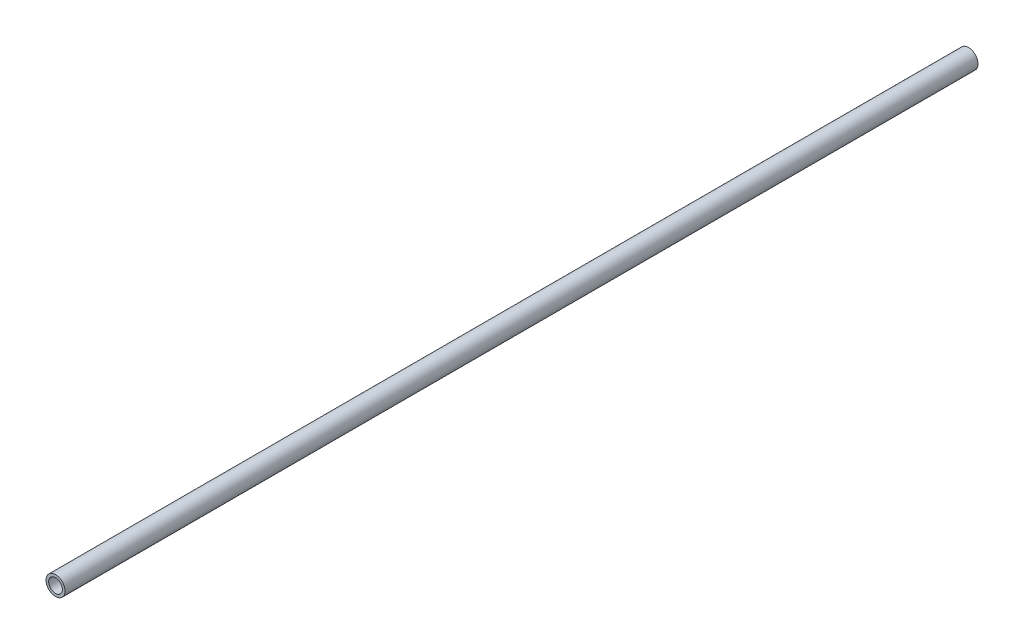
ISO-10303-21;
HEADER;
FILE_DESCRIPTION(('STEP AP214'),'2;1');
FILE_NAME('part.step','',(''),(''),'','','');
FILE_SCHEMA(('AUTOMOTIVE_DESIGN { 1 0 10303 214 1 1 1 1 }'));
ENDSEC;
DATA;
#1=APPLICATION_CONTEXT('core data for automotive mechanical design processes');
#2=APPLICATION_PROTOCOL_DEFINITION('international standard','automotive_design',2000,#1);
#3=PRODUCT_CONTEXT('',#1,'mechanical');
#4=PRODUCT('Part','Part','',(#3));
#5=PRODUCT_RELATED_PRODUCT_CATEGORY('part','',(#4));
#6=PRODUCT_DEFINITION_FORMATION('','',#4);
#7=PRODUCT_DEFINITION_CONTEXT('part definition',#1,'design');
#8=PRODUCT_DEFINITION('design','',#6,#7);
#9=PRODUCT_DEFINITION_SHAPE('','',#8);
#10=(LENGTH_UNIT() NAMED_UNIT(*) SI_UNIT(.MILLI.,.METRE.));
#11=(NAMED_UNIT(*) PLANE_ANGLE_UNIT() SI_UNIT($,.RADIAN.));
#12=(NAMED_UNIT(*) SI_UNIT($,.STERADIAN.) SOLID_ANGLE_UNIT());
#13=UNCERTAINTY_MEASURE_WITH_UNIT(LENGTH_MEASURE(1.E-05),#10,'distance_accuracy_value','');
#14=(GEOMETRIC_REPRESENTATION_CONTEXT(3) GLOBAL_UNCERTAINTY_ASSIGNED_CONTEXT((#13)) GLOBAL_UNIT_ASSIGNED_CONTEXT((#10,
#11,#12)) REPRESENTATION_CONTEXT('',''));
#15=CARTESIAN_POINT('',(0.,0.,0.));
#16=DIRECTION('',(0.,0.,1.));
#17=DIRECTION('',(1.,0.,0.));
#18=AXIS2_PLACEMENT_3D('',#15,#16,#17);
#19=CARTESIAN_POINT('',(0.,0.,152.4));
#20=DIRECTION('',(0.,0.,1.));
#21=DIRECTION('',(1.,0.,0.));
#22=AXIS2_PLACEMENT_3D('',#19,#20,#21);
#23=PLANE('',#22);
#24=CARTESIAN_POINT('',(0.,0.,152.4));
#25=DIRECTION('',(0.,0.,1.));
#26=DIRECTION('',(1.,0.,0.));
#27=AXIS2_PLACEMENT_3D('',#24,#25,#26);
#28=CIRCLE('',#27,3.175);
#29=CARTESIAN_POINT('',(-3.175,0.,152.4));
#30=VERTEX_POINT('',#29);
#31=EDGE_CURVE('E10',#30,#30,#28,.T.);
#32=ORIENTED_EDGE('',*,*,#31,.T.);
#33=EDGE_LOOP('',(#32));
#34=FACE_BOUND('',#33,.T.);
#35=CARTESIAN_POINT('',(0.,0.,152.4));
#36=DIRECTION('',(0.,0.,1.));
#37=DIRECTION('',(1.,0.,0.));
#38=AXIS2_PLACEMENT_3D('',#35,#36,#37);
#39=CIRCLE('',#38,2.286);
#40=CARTESIAN_POINT('',(-2.286,0.,152.4));
#41=VERTEX_POINT('',#40);
#42=EDGE_CURVE('E41',#41,#41,#39,.T.);
#43=ORIENTED_EDGE('',*,*,#42,.F.);
#44=EDGE_LOOP('',(#43));
#45=FACE_BOUND('',#44,.T.);
#46=ADVANCED_FACE('F30',(#34,#45),#23,.T.);
#47=CARTESIAN_POINT('',(0.,0.,-152.4));
#48=DIRECTION('',(0.,0.,1.));
#49=DIRECTION('',(1.,0.,0.));
#50=AXIS2_PLACEMENT_3D('',#47,#48,#49);
#51=PLANE('',#50);
#52=CARTESIAN_POINT('',(0.,0.,-152.4));
#53=DIRECTION('',(0.,0.,1.));
#54=DIRECTION('',(1.,0.,0.));
#55=AXIS2_PLACEMENT_3D('',#52,#53,#54);
#56=CIRCLE('',#55,3.175);
#57=CARTESIAN_POINT('',(-3.175,0.,-152.4));
#58=VERTEX_POINT('',#57);
#59=EDGE_CURVE('E34',#58,#58,#56,.T.);
#60=ORIENTED_EDGE('',*,*,#59,.F.);
#61=EDGE_LOOP('',(#60));
#62=FACE_BOUND('',#61,.T.);
#63=CARTESIAN_POINT('',(0.,0.,-152.4));
#64=DIRECTION('',(0.,0.,1.));
#65=DIRECTION('',(1.,0.,0.));
#66=AXIS2_PLACEMENT_3D('',#63,#64,#65);
#67=CIRCLE('',#66,2.286);
#68=CARTESIAN_POINT('',(-2.286,0.,-152.4));
#69=VERTEX_POINT('',#68);
#70=EDGE_CURVE('E43',#69,#69,#67,.T.);
#71=ORIENTED_EDGE('',*,*,#70,.T.);
#72=EDGE_LOOP('',(#71));
#73=FACE_BOUND('',#72,.T.);
#74=ADVANCED_FACE('F53',(#62,#73),#51,.F.);
#75=CARTESIAN_POINT('',(0.,0.,152.4));
#76=DIRECTION('',(0.,0.,-1.));
#77=DIRECTION('',(-1.,0.,0.));
#78=AXIS2_PLACEMENT_3D('',#75,#76,#77);
#79=CYLINDRICAL_SURFACE('',#78,3.175);
#80=CARTESIAN_POINT('',(-3.175,0.,152.4));
#81=CARTESIAN_POINT('',(-3.175,0.,149.225));
#82=CARTESIAN_POINT('',(-3.175,0.,146.05));
#83=CARTESIAN_POINT('',(-3.175,0.,139.7));
#84=CARTESIAN_POINT('',(-3.175,0.,136.525));
#85=CARTESIAN_POINT('',(-3.175,0.,130.175));
#86=CARTESIAN_POINT('',(-3.175,0.,127.));
#87=CARTESIAN_POINT('',(-3.175,0.,120.65));
#88=CARTESIAN_POINT('',(-3.175,0.,117.475));
#89=CARTESIAN_POINT('',(-3.175,0.,111.125));
#90=CARTESIAN_POINT('',(-3.175,0.,107.95));
#91=CARTESIAN_POINT('',(-3.175,0.,101.6));
#92=CARTESIAN_POINT('',(-3.175,0.,98.425));
#93=CARTESIAN_POINT('',(-3.175,0.,92.075));
#94=CARTESIAN_POINT('',(-3.175,0.,88.9));
#95=CARTESIAN_POINT('',(-3.175,0.,82.55));
#96=CARTESIAN_POINT('',(-3.175,0.,79.375));
#97=CARTESIAN_POINT('',(-3.175,0.,73.025));
#98=CARTESIAN_POINT('',(-3.175,0.,69.85));
#99=CARTESIAN_POINT('',(-3.175,0.,63.5));
#100=CARTESIAN_POINT('',(-3.175,0.,60.325));
#101=CARTESIAN_POINT('',(-3.175,0.,53.975));
#102=CARTESIAN_POINT('',(-3.175,0.,50.8));
#103=CARTESIAN_POINT('',(-3.175,0.,44.45));
#104=CARTESIAN_POINT('',(-3.175,0.,41.275));
#105=CARTESIAN_POINT('',(-3.175,0.,34.925));
#106=CARTESIAN_POINT('',(-3.175,0.,31.75));
#107=CARTESIAN_POINT('',(-3.175,0.,25.4));
#108=CARTESIAN_POINT('',(-3.175,0.,22.225));
#109=CARTESIAN_POINT('',(-3.175,0.,15.875));
#110=CARTESIAN_POINT('',(-3.175,0.,12.7));
#111=CARTESIAN_POINT('',(-3.175,0.,6.34999999999998));
#112=CARTESIAN_POINT('',(-3.175,0.,3.17499999999997));
#113=CARTESIAN_POINT('',(-3.175,0.,-3.17500000000003));
#114=CARTESIAN_POINT('',(-3.175,0.,-6.35000000000003));
#115=CARTESIAN_POINT('',(-3.175,0.,-12.7));
#116=CARTESIAN_POINT('',(-3.175,0.,-15.875));
#117=CARTESIAN_POINT('',(-3.175,0.,-22.225));
#118=CARTESIAN_POINT('',(-3.175,0.,-25.4));
#119=CARTESIAN_POINT('',(-3.175,0.,-31.75));
#120=CARTESIAN_POINT('',(-3.175,0.,-34.925));
#121=CARTESIAN_POINT('',(-3.175,0.,-41.275));
#122=CARTESIAN_POINT('',(-3.175,0.,-44.45));
#123=CARTESIAN_POINT('',(-3.175,0.,-50.8));
#124=CARTESIAN_POINT('',(-3.175,0.,-53.975));
#125=CARTESIAN_POINT('',(-3.175,0.,-60.325));
#126=CARTESIAN_POINT('',(-3.175,0.,-63.5));
#127=CARTESIAN_POINT('',(-3.175,0.,-69.85));
#128=CARTESIAN_POINT('',(-3.175,0.,-73.025));
#129=CARTESIAN_POINT('',(-3.175,0.,-79.375));
#130=CARTESIAN_POINT('',(-3.175,0.,-82.5500000000001));
#131=CARTESIAN_POINT('',(-3.175,0.,-88.9));
#132=CARTESIAN_POINT('',(-3.175,0.,-92.0750000000001));
#133=CARTESIAN_POINT('',(-3.175,0.,-98.425));
#134=CARTESIAN_POINT('',(-3.175,0.,-101.6));
#135=CARTESIAN_POINT('',(-3.175,0.,-107.95));
#136=CARTESIAN_POINT('',(-3.175,0.,-111.125));
#137=CARTESIAN_POINT('',(-3.175,0.,-117.475));
#138=CARTESIAN_POINT('',(-3.175,0.,-120.65));
#139=CARTESIAN_POINT('',(-3.175,0.,-127.));
#140=CARTESIAN_POINT('',(-3.175,0.,-130.175));
#141=CARTESIAN_POINT('',(-3.175,0.,-136.525));
#142=CARTESIAN_POINT('',(-3.175,0.,-139.7));
#143=CARTESIAN_POINT('',(-3.175,0.,-146.05));
#144=CARTESIAN_POINT('',(-3.175,0.,-149.225));
#145=CARTESIAN_POINT('',(-3.175,0.,-152.4));
#146=B_SPLINE_CURVE_WITH_KNOTS('',3,(#80,#81,#82,#83,#84,#85,#86,#87,#88,#89,#90,#91,#92,#93,
#94,#95,#96,#97,#98,#99,#100,#101,#102,#103,#104,#105,#106,#107,#108,#109,#110,#111,#112,#113,
#114,#115,#116,#117,#118,#119,#120,#121,#122,#123,#124,#125,#126,#127,#128,#129,#130,#131,#132,
#133,#134,#135,#136,#137,#138,#139,#140,#141,#142,#143,#144,#145),.UNSPECIFIED.,.F.,.F.,(4,2,2,
2,2,2,2,2,2,2,2,2,2,2,2,2,2,2,2,2,2,2,2,2,2,2,2,2,2,2,2,2,4),(0.,9.52499999999998,19.05,28.575,
38.1,47.625,57.15,66.675,76.2,85.725,95.25,104.775,114.3,123.825,133.35,142.875,152.4,161.925,
171.45,180.975,190.5,200.025,209.55,219.075,228.6,238.125,247.65,257.175,266.7,276.225,285.75,
295.275,304.8),.UNSPECIFIED.);
#147=EDGE_CURVE('BSEAM32',#30,#58,#146,.T.);
#148=ORIENTED_EDGE('',*,*,#31,.F.);
#149=ORIENTED_EDGE('',*,*,#59,.T.);
#150=ORIENTED_EDGE('',*,*,#147,.T.);
#151=ORIENTED_EDGE('',*,*,#147,.F.);
#152=EDGE_LOOP('',(#148,#150,#149,#151));
#153=FACE_BOUND('',#152,.T.);
#154=ADVANCED_FACE('F32',(#153),#79,.T.);
#155=CARTESIAN_POINT('',(0.,0.,152.4));
#156=DIRECTION('',(0.,0.,-1.));
#157=DIRECTION('',(-1.,0.,0.));
#158=AXIS2_PLACEMENT_3D('',#155,#156,#157);
#159=CYLINDRICAL_SURFACE('',#158,2.286);
#160=CARTESIAN_POINT('',(-2.286,0.,152.4));
#161=CARTESIAN_POINT('',(-2.286,0.,149.225));
#162=CARTESIAN_POINT('',(-2.286,0.,146.05));
#163=CARTESIAN_POINT('',(-2.286,0.,139.7));
#164=CARTESIAN_POINT('',(-2.286,0.,136.525));
#165=CARTESIAN_POINT('',(-2.286,0.,130.175));
#166=CARTESIAN_POINT('',(-2.286,0.,127.));
#167=CARTESIAN_POINT('',(-2.286,0.,120.65));
#168=CARTESIAN_POINT('',(-2.286,0.,117.475));
#169=CARTESIAN_POINT('',(-2.286,0.,111.125));
#170=CARTESIAN_POINT('',(-2.286,0.,107.95));
#171=CARTESIAN_POINT('',(-2.286,0.,101.6));
#172=CARTESIAN_POINT('',(-2.286,0.,98.425));
#173=CARTESIAN_POINT('',(-2.286,0.,92.075));
#174=CARTESIAN_POINT('',(-2.286,0.,88.9));
#175=CARTESIAN_POINT('',(-2.286,0.,82.55));
#176=CARTESIAN_POINT('',(-2.286,0.,79.375));
#177=CARTESIAN_POINT('',(-2.286,0.,73.025));
#178=CARTESIAN_POINT('',(-2.286,0.,69.85));
#179=CARTESIAN_POINT('',(-2.286,0.,63.5));
#180=CARTESIAN_POINT('',(-2.286,0.,60.325));
#181=CARTESIAN_POINT('',(-2.286,0.,53.975));
#182=CARTESIAN_POINT('',(-2.286,0.,50.8));
#183=CARTESIAN_POINT('',(-2.286,0.,44.45));
#184=CARTESIAN_POINT('',(-2.286,0.,41.275));
#185=CARTESIAN_POINT('',(-2.286,0.,34.925));
#186=CARTESIAN_POINT('',(-2.286,0.,31.75));
#187=CARTESIAN_POINT('',(-2.286,0.,25.4));
#188=CARTESIAN_POINT('',(-2.286,0.,22.225));
#189=CARTESIAN_POINT('',(-2.286,0.,15.875));
#190=CARTESIAN_POINT('',(-2.286,0.,12.7));
#191=CARTESIAN_POINT('',(-2.286,0.,6.34999999999998));
#192=CARTESIAN_POINT('',(-2.286,0.,3.17499999999997));
#193=CARTESIAN_POINT('',(-2.286,0.,-3.17500000000003));
#194=CARTESIAN_POINT('',(-2.286,0.,-6.35000000000003));
#195=CARTESIAN_POINT('',(-2.286,0.,-12.7));
#196=CARTESIAN_POINT('',(-2.286,0.,-15.875));
#197=CARTESIAN_POINT('',(-2.286,0.,-22.225));
#198=CARTESIAN_POINT('',(-2.286,0.,-25.4));
#199=CARTESIAN_POINT('',(-2.286,0.,-31.75));
#200=CARTESIAN_POINT('',(-2.286,0.,-34.925));
#201=CARTESIAN_POINT('',(-2.286,0.,-41.275));
#202=CARTESIAN_POINT('',(-2.286,0.,-44.45));
#203=CARTESIAN_POINT('',(-2.286,0.,-50.8));
#204=CARTESIAN_POINT('',(-2.286,0.,-53.975));
#205=CARTESIAN_POINT('',(-2.286,0.,-60.325));
#206=CARTESIAN_POINT('',(-2.286,0.,-63.5));
#207=CARTESIAN_POINT('',(-2.286,0.,-69.85));
#208=CARTESIAN_POINT('',(-2.286,0.,-73.025));
#209=CARTESIAN_POINT('',(-2.286,0.,-79.375));
#210=CARTESIAN_POINT('',(-2.286,0.,-82.5500000000001));
#211=CARTESIAN_POINT('',(-2.286,0.,-88.9));
#212=CARTESIAN_POINT('',(-2.286,0.,-92.0750000000001));
#213=CARTESIAN_POINT('',(-2.286,0.,-98.425));
#214=CARTESIAN_POINT('',(-2.286,0.,-101.6));
#215=CARTESIAN_POINT('',(-2.286,0.,-107.95));
#216=CARTESIAN_POINT('',(-2.286,0.,-111.125));
#217=CARTESIAN_POINT('',(-2.286,0.,-117.475));
#218=CARTESIAN_POINT('',(-2.286,0.,-120.65));
#219=CARTESIAN_POINT('',(-2.286,0.,-127.));
#220=CARTESIAN_POINT('',(-2.286,0.,-130.175));
#221=CARTESIAN_POINT('',(-2.286,0.,-136.525));
#222=CARTESIAN_POINT('',(-2.286,0.,-139.7));
#223=CARTESIAN_POINT('',(-2.286,0.,-146.05));
#224=CARTESIAN_POINT('',(-2.286,0.,-149.225));
#225=CARTESIAN_POINT('',(-2.286,0.,-152.4));
#226=B_SPLINE_CURVE_WITH_KNOTS('',3,(#160,#161,#162,#163,#164,#165,#166,#167,#168,#169,#170,
#171,#172,#173,#174,#175,#176,#177,#178,#179,#180,#181,#182,#183,#184,#185,#186,#187,#188,#189,
#190,#191,#192,#193,#194,#195,#196,#197,#198,#199,#200,#201,#202,#203,#204,#205,#206,#207,#208,
#209,#210,#211,#212,#213,#214,#215,#216,#217,#218,#219,#220,#221,#222,#223,#224,#225),
.UNSPECIFIED.,.F.,.F.,(4,2,2,2,2,2,2,2,2,2,2,2,2,2,2,2,2,2,2,2,2,2,2,2,2,2,2,2,2,2,2,2,4),(0.,
9.52499999999998,19.05,28.575,38.1,47.625,57.15,66.675,76.2,85.725,95.25,104.775,114.3,123.825,
133.35,142.875,152.4,161.925,171.45,180.975,190.5,200.025,209.55,219.075,228.6,238.125,247.65,
257.175,266.7,276.225,285.75,295.275,304.8),.UNSPECIFIED.);
#227=EDGE_CURVE('BSEAM49',#41,#69,#226,.T.);
#228=ORIENTED_EDGE('',*,*,#42,.T.);
#229=ORIENTED_EDGE('',*,*,#70,.F.);
#230=ORIENTED_EDGE('',*,*,#227,.T.);
#231=ORIENTED_EDGE('',*,*,#227,.F.);
#232=EDGE_LOOP('',(#228,#230,#229,#231));
#233=FACE_BOUND('',#232,.T.);
#234=ADVANCED_FACE('F49',(#233),#159,.F.);
#235=CLOSED_SHELL('',(#46,#74,#154,#234));
#236=MANIFOLD_SOLID_BREP('B2',#235);
#237=ADVANCED_BREP_SHAPE_REPRESENTATION('',(#18,#236),#14);
#238=SHAPE_DEFINITION_REPRESENTATION(#9,#237);
ENDSEC;
END-ISO-10303-21;
